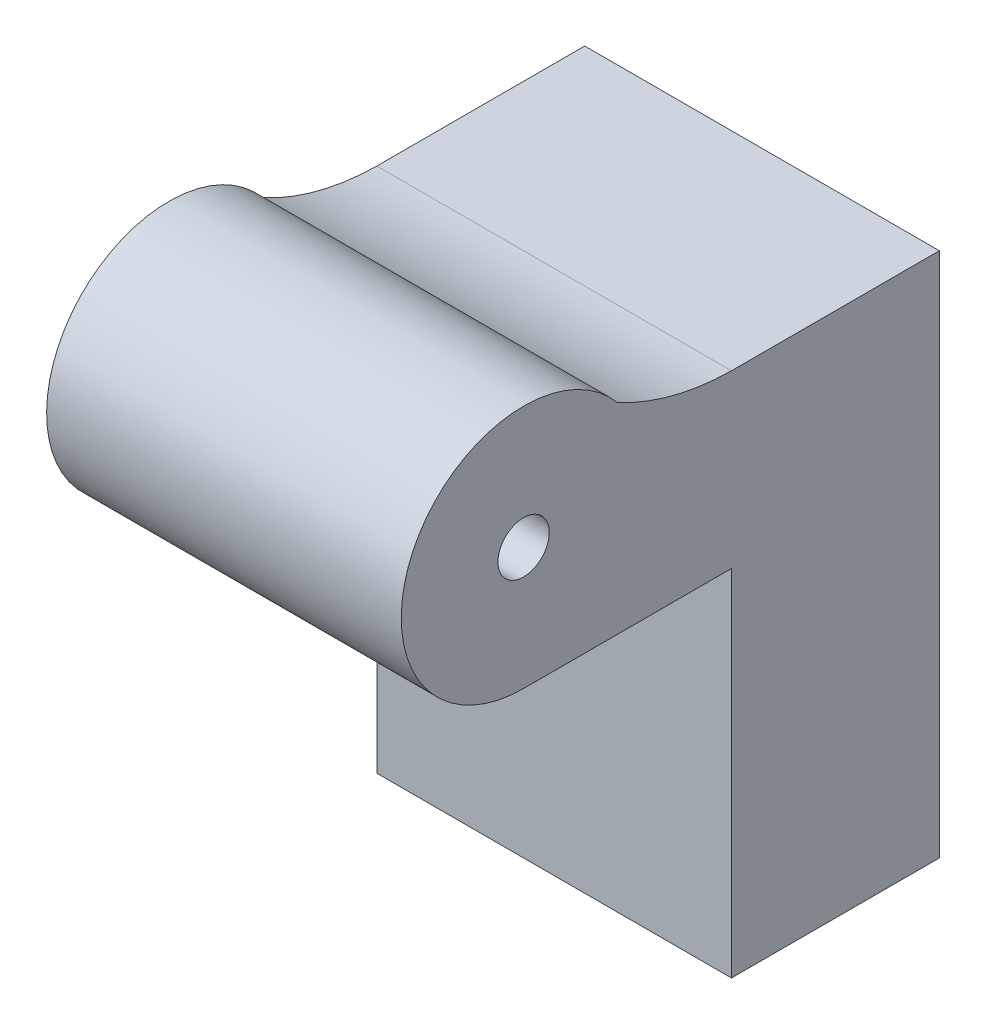
ISO-10303-21;
HEADER;
FILE_DESCRIPTION(('STEP AP214'),'2;1');
FILE_NAME('part.step','',(''),(''),'','','');
FILE_SCHEMA(('AUTOMOTIVE_DESIGN { 1 0 10303 214 1 1 1 1 }'));
ENDSEC;
DATA;
#1=APPLICATION_CONTEXT('core data for automotive mechanical design processes');
#2=APPLICATION_PROTOCOL_DEFINITION('international standard','automotive_design',2000,#1);
#3=PRODUCT_CONTEXT('',#1,'mechanical');
#4=PRODUCT('Part','Part','',(#3));
#5=PRODUCT_RELATED_PRODUCT_CATEGORY('part','',(#4));
#6=PRODUCT_DEFINITION_FORMATION('','',#4);
#7=PRODUCT_DEFINITION_CONTEXT('part definition',#1,'design');
#8=PRODUCT_DEFINITION('design','',#6,#7);
#9=PRODUCT_DEFINITION_SHAPE('','',#8);
#10=(LENGTH_UNIT() NAMED_UNIT(*) SI_UNIT(.MILLI.,.METRE.));
#11=(NAMED_UNIT(*) PLANE_ANGLE_UNIT() SI_UNIT($,.RADIAN.));
#12=(NAMED_UNIT(*) SI_UNIT($,.STERADIAN.) SOLID_ANGLE_UNIT());
#13=UNCERTAINTY_MEASURE_WITH_UNIT(LENGTH_MEASURE(1.E-05),#10,'distance_accuracy_value','');
#14=(GEOMETRIC_REPRESENTATION_CONTEXT(3) GLOBAL_UNCERTAINTY_ASSIGNED_CONTEXT((#13)) GLOBAL_UNIT_ASSIGNED_CONTEXT((#10,
#11,#12)) REPRESENTATION_CONTEXT('',''));
#15=CARTESIAN_POINT('',(0.,0.,0.));
#16=DIRECTION('',(0.,0.,1.));
#17=DIRECTION('',(1.,0.,0.));
#18=AXIS2_PLACEMENT_3D('',#15,#16,#17);
#19=CARTESIAN_POINT('',(0.,43.,17.));
#20=DIRECTION('',(0.,0.,-1.));
#21=DIRECTION('',(-1.,0.,0.));
#22=AXIS2_PLACEMENT_3D('',#19,#20,#21);
#23=PLANE('',#22);
#24=DIRECTION('',(1.,0.,0.));
#25=VECTOR('',#24,1.);
#26=CARTESIAN_POINT('',(-23.6363280457481,29.,17.));
#27=LINE('',#26,#25);
#28=CARTESIAN_POINT('',(0.,29.,17.));
#29=VERTEX_POINT('',#28);
#30=CARTESIAN_POINT('',(29.,29.,17.));
#31=VERTEX_POINT('',#30);
#32=EDGE_CURVE('E58',#29,#31,#27,.T.);
#33=ORIENTED_EDGE('',*,*,#32,.F.);
#34=DIRECTION('',(0.,-1.,0.));
#35=VECTOR('',#34,1.);
#36=CARTESIAN_POINT('',(0.,43.,17.));
#37=LINE('',#36,#35);
#38=CARTESIAN_POINT('',(0.,0.,17.));
#39=VERTEX_POINT('',#38);
#40=EDGE_CURVE('E11',#29,#39,#37,.T.);
#41=ORIENTED_EDGE('',*,*,#40,.T.);
#42=DIRECTION('',(1.,0.,0.));
#43=VECTOR('',#42,1.);
#44=CARTESIAN_POINT('',(0.,0.,17.));
#45=LINE('',#44,#43);
#46=CARTESIAN_POINT('',(29.,0.,17.));
#47=VERTEX_POINT('',#46);
#48=EDGE_CURVE('E185',#39,#47,#45,.T.);
#49=ORIENTED_EDGE('',*,*,#48,.T.);
#50=DIRECTION('',(0.,-1.,0.));
#51=VECTOR('',#50,1.);
#52=CARTESIAN_POINT('',(29.,43.,17.));
#53=LINE('',#52,#51);
#54=EDGE_CURVE('E49',#31,#47,#53,.T.);
#55=ORIENTED_EDGE('',*,*,#54,.F.);
#56=EDGE_LOOP('',(#33,#41,#49,#55));
#57=FACE_BOUND('',#56,.T.);
#58=ADVANCED_FACE('F40',(#57),#23,.F.);
#59=CARTESIAN_POINT('',(0.,43.,0.));
#60=DIRECTION('',(1.,0.,0.));
#61=DIRECTION('',(0.,0.,-1.));
#62=AXIS2_PLACEMENT_3D('',#59,#60,#61);
#63=PLANE('',#62);
#64=DIRECTION('',(0.,0.,1.));
#65=VECTOR('',#64,1.);
#66=CARTESIAN_POINT('',(0.,0.,0.));
#67=LINE('',#66,#65);
#68=CARTESIAN_POINT('',(0.,0.,0.));
#69=VERTEX_POINT('',#68);
#70=EDGE_CURVE('E170',#69,#39,#67,.T.);
#71=ORIENTED_EDGE('',*,*,#70,.T.);
#72=ORIENTED_EDGE('',*,*,#40,.F.);
#73=DIRECTION('',(0.,0.,1.));
#74=VECTOR('',#73,1.);
#75=CARTESIAN_POINT('',(0.,29.,0.));
#76=LINE('',#75,#74);
#77=CARTESIAN_POINT('',(0.,29.,34.));
#78=VERTEX_POINT('',#77);
#79=EDGE_CURVE('E160',#29,#78,#76,.T.);
#80=ORIENTED_EDGE('',*,*,#79,.T.);
#81=CARTESIAN_POINT('',(0.,39.,34.));
#82=DIRECTION('',(1.,0.,0.));
#83=DIRECTION('',(0.,0.,-1.));
#84=AXIS2_PLACEMENT_3D('',#81,#82,#83);
#85=CIRCLE('',#84,10.);
#86=CARTESIAN_POINT('',(0.,45.4218148657881,26.3344736756344));
#87=VERTEX_POINT('',#86);
#88=EDGE_CURVE('E131',#78,#87,#85,.F.);
#89=ORIENTED_EDGE('',*,*,#88,.T.);
#90=CARTESIAN_POINT('',(0.,63.1143386954014,16.7627706154264));
#91=DIRECTION('',(1.,0.,0.));
#92=DIRECTION('',(0.,0.,-1.));
#93=AXIS2_PLACEMENT_3D('',#90,#91,#92);
#94=CIRCLE('',#93,20.1157375935915);
#95=CARTESIAN_POINT('',(0.,43.,17.));
#96=VERTEX_POINT('',#95);
#97=EDGE_CURVE('E158',#87,#96,#94,.T.);
#98=ORIENTED_EDGE('',*,*,#97,.T.);
#99=DIRECTION('',(0.,0.,1.));
#100=VECTOR('',#99,1.);
#101=CARTESIAN_POINT('',(0.,43.,0.));
#102=LINE('',#101,#100);
#103=CARTESIAN_POINT('',(0.,43.,0.));
#104=VERTEX_POINT('',#103);
#105=EDGE_CURVE('E100',#104,#96,#102,.T.);
#106=ORIENTED_EDGE('',*,*,#105,.F.);
#107=DIRECTION('',(0.,-1.,0.));
#108=VECTOR('',#107,1.);
#109=CARTESIAN_POINT('',(0.,43.,0.));
#110=LINE('',#109,#108);
#111=EDGE_CURVE('E181',#104,#69,#110,.T.);
#112=ORIENTED_EDGE('',*,*,#111,.T.);
#113=EDGE_LOOP('',(#71,#72,#80,#89,#98,#106,#112));
#114=FACE_BOUND('',#113,.T.);
#115=CARTESIAN_POINT('',(0.,39.,34.));
#116=DIRECTION('',(1.,0.,0.));
#117=DIRECTION('',(0.,0.,-1.));
#118=AXIS2_PLACEMENT_3D('',#115,#116,#117);
#119=CIRCLE('',#118,2.1);
#120=CARTESIAN_POINT('',(0.,39.,31.9));
#121=VERTEX_POINT('',#120);
#122=EDGE_CURVE('E147',#121,#121,#119,.F.);
#123=ORIENTED_EDGE('',*,*,#122,.F.);
#124=EDGE_LOOP('',(#123));
#125=FACE_BOUND('',#124,.T.);
#126=ADVANCED_FACE('F42',(#114,#125),#63,.F.);
#127=CARTESIAN_POINT('',(29.,43.,0.));
#128=DIRECTION('',(-1.,0.,0.));
#129=DIRECTION('',(0.,0.,1.));
#130=AXIS2_PLACEMENT_3D('',#127,#128,#129);
#131=PLANE('',#130);
#132=DIRECTION('',(0.,0.,-1.));
#133=VECTOR('',#132,1.);
#134=CARTESIAN_POINT('',(29.,0.,0.));
#135=LINE('',#134,#133);
#136=CARTESIAN_POINT('',(29.,0.,0.));
#137=VERTEX_POINT('',#136);
#138=EDGE_CURVE('E189',#47,#137,#135,.T.);
#139=ORIENTED_EDGE('',*,*,#138,.T.);
#140=DIRECTION('',(0.,-1.,0.));
#141=VECTOR('',#140,1.);
#142=CARTESIAN_POINT('',(29.,43.,0.));
#143=LINE('',#142,#141);
#144=CARTESIAN_POINT('',(29.,43.,0.));
#145=VERTEX_POINT('',#144);
#146=EDGE_CURVE('E196',#145,#137,#143,.T.);
#147=ORIENTED_EDGE('',*,*,#146,.F.);
#148=DIRECTION('',(0.,0.,-1.));
#149=VECTOR('',#148,1.);
#150=CARTESIAN_POINT('',(29.,43.,0.));
#151=LINE('',#150,#149);
#152=CARTESIAN_POINT('',(29.,43.,17.));
#153=VERTEX_POINT('',#152);
#154=EDGE_CURVE('E176',#153,#145,#151,.T.);
#155=ORIENTED_EDGE('',*,*,#154,.F.);
#156=CARTESIAN_POINT('',(29.,63.1143386954014,16.7627706154264));
#157=DIRECTION('',(1.,0.,0.));
#158=DIRECTION('',(0.,0.,-1.));
#159=AXIS2_PLACEMENT_3D('',#156,#157,#158);
#160=CIRCLE('',#159,20.1157375935915);
#161=CARTESIAN_POINT('',(29.,45.4218148657881,26.3344736756344));
#162=VERTEX_POINT('',#161);
#163=EDGE_CURVE('E130',#153,#162,#160,.F.);
#164=ORIENTED_EDGE('',*,*,#163,.T.);
#165=CARTESIAN_POINT('',(29.,39.,34.));
#166=DIRECTION('',(1.,0.,0.));
#167=DIRECTION('',(0.,0.,-1.));
#168=AXIS2_PLACEMENT_3D('',#165,#166,#167);
#169=CIRCLE('',#168,10.);
#170=CARTESIAN_POINT('',(29.,29.,34.));
#171=VERTEX_POINT('',#170);
#172=EDGE_CURVE('E137',#162,#171,#169,.T.);
#173=ORIENTED_EDGE('',*,*,#172,.T.);
#174=DIRECTION('',(0.,0.,-1.));
#175=VECTOR('',#174,1.);
#176=CARTESIAN_POINT('',(29.,29.,0.));
#177=LINE('',#176,#175);
#178=EDGE_CURVE('E121',#171,#31,#177,.T.);
#179=ORIENTED_EDGE('',*,*,#178,.T.);
#180=ORIENTED_EDGE('',*,*,#54,.T.);
#181=EDGE_LOOP('',(#139,#147,#155,#164,#173,#179,#180));
#182=FACE_BOUND('',#181,.T.);
#183=CARTESIAN_POINT('',(29.,39.,34.));
#184=DIRECTION('',(1.,0.,0.));
#185=DIRECTION('',(0.,0.,-1.));
#186=AXIS2_PLACEMENT_3D('',#183,#184,#185);
#187=CIRCLE('',#186,2.1);
#188=CARTESIAN_POINT('',(29.,39.,31.9));
#189=VERTEX_POINT('',#188);
#190=EDGE_CURVE('E154',#189,#189,#187,.T.);
#191=ORIENTED_EDGE('',*,*,#190,.F.);
#192=EDGE_LOOP('',(#191));
#193=FACE_BOUND('',#192,.T.);
#194=ADVANCED_FACE('F142',(#182,#193),#131,.F.);
#195=CARTESIAN_POINT('',(0.,43.,0.));
#196=DIRECTION('',(0.,0.,1.));
#197=DIRECTION('',(1.,0.,0.));
#198=AXIS2_PLACEMENT_3D('',#195,#196,#197);
#199=PLANE('',#198);
#200=DIRECTION('',(-1.,0.,0.));
#201=VECTOR('',#200,1.);
#202=CARTESIAN_POINT('',(0.,0.,0.));
#203=LINE('',#202,#201);
#204=EDGE_CURVE('E93',#137,#69,#203,.T.);
#205=ORIENTED_EDGE('',*,*,#204,.T.);
#206=ORIENTED_EDGE('',*,*,#111,.F.);
#207=DIRECTION('',(-1.,0.,0.));
#208=VECTOR('',#207,1.);
#209=CARTESIAN_POINT('',(0.,43.,0.));
#210=LINE('',#209,#208);
#211=EDGE_CURVE('E70',#145,#104,#210,.T.);
#212=ORIENTED_EDGE('',*,*,#211,.F.);
#213=ORIENTED_EDGE('',*,*,#146,.T.);
#214=EDGE_LOOP('',(#205,#206,#212,#213));
#215=FACE_BOUND('',#214,.T.);
#216=ADVANCED_FACE('F207',(#215),#199,.F.);
#217=CARTESIAN_POINT('',(0.,43.,0.));
#218=DIRECTION('',(0.,1.,0.));
#219=DIRECTION('',(0.,0.,1.));
#220=AXIS2_PLACEMENT_3D('',#217,#218,#219);
#221=PLANE('',#220);
#222=ORIENTED_EDGE('',*,*,#105,.T.);
#223=DIRECTION('',(1.,0.,0.));
#224=VECTOR('',#223,1.);
#225=CARTESIAN_POINT('',(0.,43.,17.));
#226=LINE('',#225,#224);
#227=EDGE_CURVE('E173',#96,#153,#226,.T.);
#228=ORIENTED_EDGE('',*,*,#227,.T.);
#229=ORIENTED_EDGE('',*,*,#154,.T.);
#230=ORIENTED_EDGE('',*,*,#211,.T.);
#231=EDGE_LOOP('',(#222,#228,#229,#230));
#232=FACE_BOUND('',#231,.T.);
#233=ADVANCED_FACE('F211',(#232),#221,.T.);
#234=CARTESIAN_POINT('',(0.,0.,0.));
#235=DIRECTION('',(0.,1.,0.));
#236=DIRECTION('',(0.,0.,1.));
#237=AXIS2_PLACEMENT_3D('',#234,#235,#236);
#238=PLANE('',#237);
#239=ORIENTED_EDGE('',*,*,#70,.F.);
#240=ORIENTED_EDGE('',*,*,#204,.F.);
#241=ORIENTED_EDGE('',*,*,#138,.F.);
#242=ORIENTED_EDGE('',*,*,#48,.F.);
#243=EDGE_LOOP('',(#239,#240,#241,#242));
#244=FACE_BOUND('',#243,.T.);
#245=ADVANCED_FACE('F204',(#244),#238,.F.);
#246=CARTESIAN_POINT('',(-23.6363280457481,63.1143386954014,16.7627706154264));
#247=DIRECTION('',(1.,0.,0.));
#248=DIRECTION('',(0.,0.,-1.));
#249=AXIS2_PLACEMENT_3D('',#246,#247,#248);
#250=CYLINDRICAL_SURFACE('',#249,20.1157375935915);
#251=ORIENTED_EDGE('',*,*,#97,.F.);
#252=DIRECTION('',(1.,0.,0.));
#253=VECTOR('',#252,1.);
#254=CARTESIAN_POINT('',(-23.6363280457481,45.4218148657881,26.3344736756344));
#255=LINE('',#254,#253);
#256=EDGE_CURVE('E161',#87,#162,#255,.T.);
#257=ORIENTED_EDGE('',*,*,#256,.T.);
#258=ORIENTED_EDGE('',*,*,#163,.F.);
#259=ORIENTED_EDGE('',*,*,#227,.F.);
#260=EDGE_LOOP('',(#251,#257,#258,#259));
#261=FACE_BOUND('',#260,.T.);
#262=ADVANCED_FACE('F210',(#261),#250,.F.);
#263=CARTESIAN_POINT('',(-23.6363280457481,29.,0.));
#264=DIRECTION('',(0.,-1.,0.));
#265=DIRECTION('',(0.,0.,-1.));
#266=AXIS2_PLACEMENT_3D('',#263,#264,#265);
#267=PLANE('',#266);
#268=ORIENTED_EDGE('',*,*,#79,.F.);
#269=ORIENTED_EDGE('',*,*,#32,.T.);
#270=ORIENTED_EDGE('',*,*,#178,.F.);
#271=DIRECTION('',(1.,0.,0.));
#272=VECTOR('',#271,1.);
#273=CARTESIAN_POINT('',(-23.6363280457481,29.,34.));
#274=LINE('',#273,#272);
#275=EDGE_CURVE('E125',#78,#171,#274,.T.);
#276=ORIENTED_EDGE('',*,*,#275,.F.);
#277=EDGE_LOOP('',(#268,#269,#270,#276));
#278=FACE_BOUND('',#277,.T.);
#279=ADVANCED_FACE('F124',(#278),#267,.T.);
#280=CARTESIAN_POINT('',(-28.2842712474619,39.,34.));
#281=DIRECTION('',(1.,0.,0.));
#282=DIRECTION('',(0.,0.,-1.));
#283=AXIS2_PLACEMENT_3D('',#280,#281,#282);
#284=CYLINDRICAL_SURFACE('',#283,10.);
#285=ORIENTED_EDGE('',*,*,#172,.F.);
#286=ORIENTED_EDGE('',*,*,#256,.F.);
#287=ORIENTED_EDGE('',*,*,#88,.F.);
#288=ORIENTED_EDGE('',*,*,#275,.T.);
#289=EDGE_LOOP('',(#285,#286,#287,#288));
#290=FACE_BOUND('',#289,.T.);
#291=ADVANCED_FACE('F135',(#290),#284,.T.);
#292=CARTESIAN_POINT('',(-5.93969696196701,39.,34.));
#293=DIRECTION('',(1.,0.,0.));
#294=DIRECTION('',(0.,0.,-1.));
#295=AXIS2_PLACEMENT_3D('',#292,#293,#294);
#296=CYLINDRICAL_SURFACE('',#295,2.1);
#297=ORIENTED_EDGE('',*,*,#122,.T.);
#298=EDGE_LOOP('',(#297));
#299=FACE_BOUND('',#298,.T.);
#300=ORIENTED_EDGE('',*,*,#190,.T.);
#301=EDGE_LOOP('',(#300));
#302=FACE_BOUND('',#301,.T.);
#303=ADVANCED_FACE('F242',(#299,#302),#296,.F.);
#304=CLOSED_SHELL('',(#58,#126,#194,#216,#233,#245,#262,#279,#291,#303));
#305=MANIFOLD_SOLID_BREP('B2',#304);
#306=ADVANCED_BREP_SHAPE_REPRESENTATION('',(#18,#305),#14);
#307=SHAPE_DEFINITION_REPRESENTATION(#9,#306);
ENDSEC;
END-ISO-10303-21;
